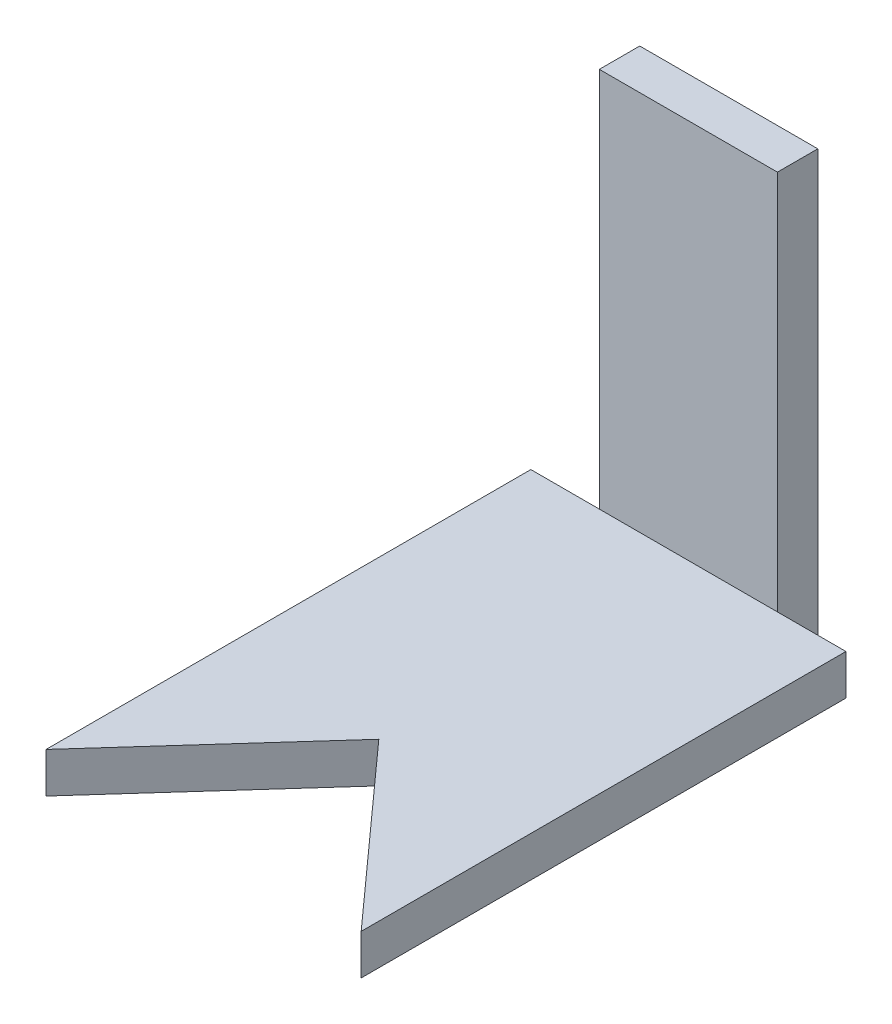
ISO-10303-21;
HEADER;
FILE_DESCRIPTION(('STEP AP214'),'2;1');
FILE_NAME('part.step','',(''),(''),'','','');
FILE_SCHEMA(('AUTOMOTIVE_DESIGN { 1 0 10303 214 1 1 1 1 }'));
ENDSEC;
DATA;
#1=APPLICATION_CONTEXT('core data for automotive mechanical design processes');
#2=APPLICATION_PROTOCOL_DEFINITION('international standard','automotive_design',2000,#1);
#3=PRODUCT_CONTEXT('',#1,'mechanical');
#4=PRODUCT('Part','Part','',(#3));
#5=PRODUCT_RELATED_PRODUCT_CATEGORY('part','',(#4));
#6=PRODUCT_DEFINITION_FORMATION('','',#4);
#7=PRODUCT_DEFINITION_CONTEXT('part definition',#1,'design');
#8=PRODUCT_DEFINITION('design','',#6,#7);
#9=PRODUCT_DEFINITION_SHAPE('','',#8);
#10=(LENGTH_UNIT() NAMED_UNIT(*) SI_UNIT(.MILLI.,.METRE.));
#11=(NAMED_UNIT(*) PLANE_ANGLE_UNIT() SI_UNIT($,.RADIAN.));
#12=(NAMED_UNIT(*) SI_UNIT($,.STERADIAN.) SOLID_ANGLE_UNIT());
#13=UNCERTAINTY_MEASURE_WITH_UNIT(LENGTH_MEASURE(1.E-05),#10,'distance_accuracy_value','');
#14=(GEOMETRIC_REPRESENTATION_CONTEXT(3) GLOBAL_UNCERTAINTY_ASSIGNED_CONTEXT((#13)) GLOBAL_UNIT_ASSIGNED_CONTEXT((#10,
#11,#12)) REPRESENTATION_CONTEXT('',''));
#15=CARTESIAN_POINT('',(0.,0.,0.));
#16=DIRECTION('',(0.,0.,1.));
#17=DIRECTION('',(1.,0.,0.));
#18=AXIS2_PLACEMENT_3D('',#15,#16,#17);
#19=CARTESIAN_POINT('',(0.,0.,6.35));
#20=DIRECTION('',(0.,1.,0.));
#21=DIRECTION('',(0.,0.,1.));
#22=AXIS2_PLACEMENT_3D('',#19,#20,#21);
#23=PLANE('',#22);
#24=DIRECTION('',(0.668646086804001,0.,-0.743580803007781));
#25=VECTOR('',#24,1.);
#26=CARTESIAN_POINT('',(-10.7696,0.,82.55));
#27=LINE('',#26,#25);
#28=CARTESIAN_POINT('',(-10.7696,0.,82.55));
#29=VERTEX_POINT('',#28);
#30=CARTESIAN_POINT('',(13.9954,0.,55.0096031444575));
#31=VERTEX_POINT('',#30);
#32=EDGE_CURVE('E125',#29,#31,#27,.T.);
#33=ORIENTED_EDGE('',*,*,#32,.F.);
#34=DIRECTION('',(0.,0.,-1.));
#35=VECTOR('',#34,1.);
#36=CARTESIAN_POINT('',(-10.7696,0.,82.55));
#37=LINE('',#36,#35);
#38=CARTESIAN_POINT('',(-10.7696,0.,6.35));
#39=VERTEX_POINT('',#38);
#40=EDGE_CURVE('E172',#29,#39,#37,.T.);
#41=ORIENTED_EDGE('',*,*,#40,.T.);
#42=DIRECTION('',(1.,0.,0.));
#43=VECTOR('',#42,1.);
#44=CARTESIAN_POINT('',(-10.7696,0.,6.35));
#45=LINE('',#44,#43);
#46=CARTESIAN_POINT('',(0.,0.,6.35));
#47=VERTEX_POINT('',#46);
#48=EDGE_CURVE('E160',#39,#47,#45,.T.);
#49=ORIENTED_EDGE('',*,*,#48,.T.);
#50=DIRECTION('',(0.,0.,-1.));
#51=VECTOR('',#50,1.);
#52=CARTESIAN_POINT('',(0.,0.,6.35));
#53=LINE('',#52,#51);
#54=CARTESIAN_POINT('',(0.,0.,0.));
#55=VERTEX_POINT('',#54);
#56=EDGE_CURVE('E42',#47,#55,#53,.T.);
#57=ORIENTED_EDGE('',*,*,#56,.T.);
#58=DIRECTION('',(1.,0.,0.));
#59=VECTOR('',#58,1.);
#60=CARTESIAN_POINT('',(0.,0.,0.));
#61=LINE('',#60,#59);
#62=CARTESIAN_POINT('',(27.9908,0.,0.));
#63=VERTEX_POINT('',#62);
#64=EDGE_CURVE('E185',#55,#63,#61,.T.);
#65=ORIENTED_EDGE('',*,*,#64,.T.);
#66=DIRECTION('',(0.,0.,-1.));
#67=VECTOR('',#66,1.);
#68=CARTESIAN_POINT('',(27.9908,0.,6.35));
#69=LINE('',#68,#67);
#70=CARTESIAN_POINT('',(27.9908,0.,6.35));
#71=VERTEX_POINT('',#70);
#72=EDGE_CURVE('E192',#71,#63,#69,.T.);
#73=ORIENTED_EDGE('',*,*,#72,.F.);
#74=CARTESIAN_POINT('',(38.7604,0.,6.35));
#75=VERTEX_POINT('',#74);
#76=EDGE_CURVE('E159',#71,#75,#45,.T.);
#77=ORIENTED_EDGE('',*,*,#76,.T.);
#78=DIRECTION('',(0.,0.,-1.));
#79=VECTOR('',#78,1.);
#80=CARTESIAN_POINT('',(38.7604,0.,82.55));
#81=LINE('',#80,#79);
#82=CARTESIAN_POINT('',(38.7604,0.,82.55));
#83=VERTEX_POINT('',#82);
#84=EDGE_CURVE('E146',#83,#75,#81,.T.);
#85=ORIENTED_EDGE('',*,*,#84,.F.);
#86=DIRECTION('',(0.668646086804001,0.,0.743580803007781));
#87=VECTOR('',#86,1.);
#88=CARTESIAN_POINT('',(13.9954,0.,55.0096031444575));
#89=LINE('',#88,#87);
#90=EDGE_CURVE('E136',#31,#83,#89,.T.);
#91=ORIENTED_EDGE('',*,*,#90,.F.);
#92=EDGE_LOOP('',(#33,#41,#49,#57,#65,#73,#77,#85,#91));
#93=FACE_BOUND('',#92,.T.);
#94=ADVANCED_FACE('F38',(#93),#23,.F.);
#95=CARTESIAN_POINT('',(-10.7696,6.35,82.55));
#96=DIRECTION('',(0.,-1.,0.));
#97=DIRECTION('',(1.,0.,0.));
#98=AXIS2_PLACEMENT_3D('',#95,#96,#97);
#99=PLANE('',#98);
#100=DIRECTION('',(0.668646086804001,0.,-0.743580803007781));
#101=VECTOR('',#100,1.);
#102=CARTESIAN_POINT('',(-10.7696,6.35,82.55));
#103=LINE('',#102,#101);
#104=CARTESIAN_POINT('',(-10.7696,6.35,82.55));
#105=VERTEX_POINT('',#104);
#106=CARTESIAN_POINT('',(13.9954,6.35,55.0096031444575));
#107=VERTEX_POINT('',#106);
#108=EDGE_CURVE('E150',#105,#107,#103,.T.);
#109=ORIENTED_EDGE('',*,*,#108,.T.);
#110=DIRECTION('',(0.668646086804001,0.,0.743580803007781));
#111=VECTOR('',#110,1.);
#112=CARTESIAN_POINT('',(13.9954,6.35,55.0096031444575));
#113=LINE('',#112,#111);
#114=CARTESIAN_POINT('',(38.7604,6.35,82.55));
#115=VERTEX_POINT('',#114);
#116=EDGE_CURVE('E137',#107,#115,#113,.T.);
#117=ORIENTED_EDGE('',*,*,#116,.T.);
#118=DIRECTION('',(0.,0.,-1.));
#119=VECTOR('',#118,1.);
#120=CARTESIAN_POINT('',(38.7604,6.35,82.55));
#121=LINE('',#120,#119);
#122=CARTESIAN_POINT('',(38.7604,6.35,6.35));
#123=VERTEX_POINT('',#122);
#124=EDGE_CURVE('E168',#115,#123,#121,.T.);
#125=ORIENTED_EDGE('',*,*,#124,.T.);
#126=DIRECTION('',(-1.,0.,0.));
#127=VECTOR('',#126,1.);
#128=CARTESIAN_POINT('',(-10.7696,6.35,6.35));
#129=LINE('',#128,#127);
#130=CARTESIAN_POINT('',(27.9908,6.35,6.35));
#131=VERTEX_POINT('',#130);
#132=EDGE_CURVE('E48',#123,#131,#129,.T.);
#133=ORIENTED_EDGE('',*,*,#132,.T.);
#134=CARTESIAN_POINT('',(0.,6.35,6.35));
#135=VERTEX_POINT('',#134);
#136=EDGE_CURVE('E11',#131,#135,#129,.T.);
#137=ORIENTED_EDGE('',*,*,#136,.T.);
#138=CARTESIAN_POINT('',(-10.7696,6.35,6.35));
#139=VERTEX_POINT('',#138);
#140=EDGE_CURVE('E49',#135,#139,#129,.T.);
#141=ORIENTED_EDGE('',*,*,#140,.T.);
#142=DIRECTION('',(0.,0.,-1.));
#143=VECTOR('',#142,1.);
#144=CARTESIAN_POINT('',(-10.7696,6.35,82.55));
#145=LINE('',#144,#143);
#146=EDGE_CURVE('E156',#105,#139,#145,.T.);
#147=ORIENTED_EDGE('',*,*,#146,.F.);
#148=EDGE_LOOP('',(#109,#117,#125,#133,#137,#141,#147));
#149=FACE_BOUND('',#148,.T.);
#150=ADVANCED_FACE('F207',(#149),#99,.F.);
#151=CARTESIAN_POINT('',(0.,0.,6.35));
#152=DIRECTION('',(0.,0.,-1.));
#153=DIRECTION('',(-1.,0.,0.));
#154=AXIS2_PLACEMENT_3D('',#151,#152,#153);
#155=PLANE('',#154);
#156=ORIENTED_EDGE('',*,*,#136,.F.);
#157=DIRECTION('',(0.,1.,0.));
#158=VECTOR('',#157,1.);
#159=CARTESIAN_POINT('',(27.9908,0.,6.35));
#160=LINE('',#159,#158);
#161=CARTESIAN_POINT('',(27.9908,66.2178,6.35));
#162=VERTEX_POINT('',#161);
#163=EDGE_CURVE('E177',#131,#162,#160,.T.);
#164=ORIENTED_EDGE('',*,*,#163,.T.);
#165=DIRECTION('',(-1.,0.,0.));
#166=VECTOR('',#165,1.);
#167=CARTESIAN_POINT('',(0.,66.2178,6.35));
#168=LINE('',#167,#166);
#169=CARTESIAN_POINT('',(0.,66.2178,6.35));
#170=VERTEX_POINT('',#169);
#171=EDGE_CURVE('E60',#162,#170,#168,.T.);
#172=ORIENTED_EDGE('',*,*,#171,.T.);
#173=DIRECTION('',(0.,-1.,0.));
#174=VECTOR('',#173,1.);
#175=CARTESIAN_POINT('',(0.,0.,6.35));
#176=LINE('',#175,#174);
#177=EDGE_CURVE('E175',#170,#135,#176,.T.);
#178=ORIENTED_EDGE('',*,*,#177,.T.);
#179=EDGE_LOOP('',(#156,#164,#172,#178));
#180=FACE_BOUND('',#179,.T.);
#181=ADVANCED_FACE('F205',(#180),#155,.F.);
#182=CARTESIAN_POINT('',(0.,0.,6.35));
#183=DIRECTION('',(1.,0.,0.));
#184=DIRECTION('',(0.,0.,-1.));
#185=AXIS2_PLACEMENT_3D('',#182,#183,#184);
#186=PLANE('',#185);
#187=DIRECTION('',(0.,-1.,0.));
#188=VECTOR('',#187,1.);
#189=CARTESIAN_POINT('',(0.,0.,0.));
#190=LINE('',#189,#188);
#191=CARTESIAN_POINT('',(0.,66.2178,0.));
#192=VERTEX_POINT('',#191);
#193=EDGE_CURVE('E174',#192,#55,#190,.T.);
#194=ORIENTED_EDGE('',*,*,#193,.T.);
#195=ORIENTED_EDGE('',*,*,#56,.F.);
#196=EDGE_CURVE('E178',#135,#47,#176,.T.);
#197=ORIENTED_EDGE('',*,*,#196,.F.);
#198=ORIENTED_EDGE('',*,*,#177,.F.);
#199=DIRECTION('',(0.,0.,-1.));
#200=VECTOR('',#199,1.);
#201=CARTESIAN_POINT('',(0.,66.2178,6.35));
#202=LINE('',#201,#200);
#203=EDGE_CURVE('E183',#170,#192,#202,.T.);
#204=ORIENTED_EDGE('',*,*,#203,.T.);
#205=EDGE_LOOP('',(#194,#195,#197,#198,#204));
#206=FACE_BOUND('',#205,.T.);
#207=ADVANCED_FACE('F40',(#206),#186,.F.);
#208=CARTESIAN_POINT('',(27.9908,0.,6.35));
#209=DIRECTION('',(-1.,0.,0.));
#210=DIRECTION('',(0.,0.,1.));
#211=AXIS2_PLACEMENT_3D('',#208,#209,#210);
#212=PLANE('',#211);
#213=DIRECTION('',(0.,1.,0.));
#214=VECTOR('',#213,1.);
#215=CARTESIAN_POINT('',(27.9908,0.,0.));
#216=LINE('',#215,#214);
#217=CARTESIAN_POINT('',(27.9908,66.2178,0.));
#218=VERTEX_POINT('',#217);
#219=EDGE_CURVE('E187',#63,#218,#216,.T.);
#220=ORIENTED_EDGE('',*,*,#219,.T.);
#221=DIRECTION('',(0.,0.,-1.));
#222=VECTOR('',#221,1.);
#223=CARTESIAN_POINT('',(27.9908,66.2178,6.35));
#224=LINE('',#223,#222);
#225=EDGE_CURVE('E191',#162,#218,#224,.T.);
#226=ORIENTED_EDGE('',*,*,#225,.F.);
#227=ORIENTED_EDGE('',*,*,#163,.F.);
#228=EDGE_CURVE('E179',#71,#131,#160,.T.);
#229=ORIENTED_EDGE('',*,*,#228,.F.);
#230=ORIENTED_EDGE('',*,*,#72,.T.);
#231=EDGE_LOOP('',(#220,#226,#227,#229,#230));
#232=FACE_BOUND('',#231,.T.);
#233=ADVANCED_FACE('F202',(#232),#212,.F.);
#234=CARTESIAN_POINT('',(0.,66.2178,6.35));
#235=DIRECTION('',(0.,-1.,0.));
#236=DIRECTION('',(0.,0.,-1.));
#237=AXIS2_PLACEMENT_3D('',#234,#235,#236);
#238=PLANE('',#237);
#239=DIRECTION('',(-1.,0.,0.));
#240=VECTOR('',#239,1.);
#241=CARTESIAN_POINT('',(0.,66.2178,0.));
#242=LINE('',#241,#240);
#243=EDGE_CURVE('E81',#218,#192,#242,.T.);
#244=ORIENTED_EDGE('',*,*,#243,.T.);
#245=ORIENTED_EDGE('',*,*,#203,.F.);
#246=ORIENTED_EDGE('',*,*,#171,.F.);
#247=ORIENTED_EDGE('',*,*,#225,.T.);
#248=EDGE_LOOP('',(#244,#245,#246,#247));
#249=FACE_BOUND('',#248,.T.);
#250=ADVANCED_FACE('F203',(#249),#238,.F.);
#251=CARTESIAN_POINT('',(0.,0.,0.));
#252=DIRECTION('',(0.,0.,-1.));
#253=DIRECTION('',(-1.,0.,0.));
#254=AXIS2_PLACEMENT_3D('',#251,#252,#253);
#255=PLANE('',#254);
#256=ORIENTED_EDGE('',*,*,#193,.F.);
#257=ORIENTED_EDGE('',*,*,#243,.F.);
#258=ORIENTED_EDGE('',*,*,#219,.F.);
#259=ORIENTED_EDGE('',*,*,#64,.F.);
#260=EDGE_LOOP('',(#256,#257,#258,#259));
#261=FACE_BOUND('',#260,.T.);
#262=ADVANCED_FACE('F200',(#261),#255,.T.);
#263=CARTESIAN_POINT('',(0.,0.,6.35));
#264=DIRECTION('',(0.,0.,-1.));
#265=DIRECTION('',(-1.,0.,0.));
#266=AXIS2_PLACEMENT_3D('',#263,#264,#265);
#267=PLANE('',#266);
#268=ORIENTED_EDGE('',*,*,#140,.F.);
#269=ORIENTED_EDGE('',*,*,#196,.T.);
#270=ORIENTED_EDGE('',*,*,#48,.F.);
#271=DIRECTION('',(0.,-1.,0.));
#272=VECTOR('',#271,1.);
#273=CARTESIAN_POINT('',(-10.7696,0.,6.35));
#274=LINE('',#273,#272);
#275=EDGE_CURVE('E143',#139,#39,#274,.T.);
#276=ORIENTED_EDGE('',*,*,#275,.F.);
#277=EDGE_LOOP('',(#268,#269,#270,#276));
#278=FACE_BOUND('',#277,.T.);
#279=ADVANCED_FACE('F225',(#278),#267,.T.);
#280=CARTESIAN_POINT('',(-10.7696,0.,82.55));
#281=DIRECTION('',(1.,0.,0.));
#282=DIRECTION('',(0.,1.,0.));
#283=AXIS2_PLACEMENT_3D('',#280,#281,#282);
#284=PLANE('',#283);
#285=ORIENTED_EDGE('',*,*,#275,.T.);
#286=ORIENTED_EDGE('',*,*,#40,.F.);
#287=DIRECTION('',(0.,-1.,0.));
#288=VECTOR('',#287,1.);
#289=CARTESIAN_POINT('',(-10.7696,0.,82.55));
#290=LINE('',#289,#288);
#291=EDGE_CURVE('E131',#105,#29,#290,.T.);
#292=ORIENTED_EDGE('',*,*,#291,.F.);
#293=ORIENTED_EDGE('',*,*,#146,.T.);
#294=EDGE_LOOP('',(#285,#286,#292,#293));
#295=FACE_BOUND('',#294,.T.);
#296=ADVANCED_FACE('F229',(#295),#284,.F.);
#297=CARTESIAN_POINT('',(38.7604,0.,82.55));
#298=DIRECTION('',(-1.,0.,0.));
#299=DIRECTION('',(0.,0.,1.));
#300=AXIS2_PLACEMENT_3D('',#297,#298,#299);
#301=PLANE('',#300);
#302=DIRECTION('',(0.,1.,0.));
#303=VECTOR('',#302,1.);
#304=CARTESIAN_POINT('',(38.7604,0.,6.35));
#305=LINE('',#304,#303);
#306=EDGE_CURVE('E163',#75,#123,#305,.T.);
#307=ORIENTED_EDGE('',*,*,#306,.T.);
#308=ORIENTED_EDGE('',*,*,#124,.F.);
#309=DIRECTION('',(0.,1.,0.));
#310=VECTOR('',#309,1.);
#311=CARTESIAN_POINT('',(38.7604,0.,82.55));
#312=LINE('',#311,#310);
#313=EDGE_CURVE('E154',#83,#115,#312,.T.);
#314=ORIENTED_EDGE('',*,*,#313,.F.);
#315=ORIENTED_EDGE('',*,*,#84,.T.);
#316=EDGE_LOOP('',(#307,#308,#314,#315));
#317=FACE_BOUND('',#316,.T.);
#318=ADVANCED_FACE('F236',(#317),#301,.F.);
#319=ORIENTED_EDGE('',*,*,#76,.F.);
#320=ORIENTED_EDGE('',*,*,#228,.T.);
#321=ORIENTED_EDGE('',*,*,#132,.F.);
#322=ORIENTED_EDGE('',*,*,#306,.F.);
#323=EDGE_LOOP('',(#319,#320,#321,#322));
#324=FACE_BOUND('',#323,.T.);
#325=ADVANCED_FACE('F232',(#324),#267,.T.);
#326=CARTESIAN_POINT('',(-10.7696,0.,82.55));
#327=DIRECTION('',(0.743580803007781,0.,0.668646086804001));
#328=DIRECTION('',(0.668646086804001,0.,-0.743580803007781));
#329=AXIS2_PLACEMENT_3D('',#326,#327,#328);
#330=PLANE('',#329);
#331=ORIENTED_EDGE('',*,*,#108,.F.);
#332=ORIENTED_EDGE('',*,*,#291,.T.);
#333=ORIENTED_EDGE('',*,*,#32,.T.);
#334=DIRECTION('',(0.,1.,0.));
#335=VECTOR('',#334,1.);
#336=CARTESIAN_POINT('',(13.9954,0.,55.0096031444575));
#337=LINE('',#336,#335);
#338=EDGE_CURVE('E128',#31,#107,#337,.T.);
#339=ORIENTED_EDGE('',*,*,#338,.T.);
#340=EDGE_LOOP('',(#331,#332,#333,#339));
#341=FACE_BOUND('',#340,.T.);
#342=ADVANCED_FACE('F127',(#341),#330,.T.);
#343=CARTESIAN_POINT('',(13.9954,0.,55.0096031444575));
#344=DIRECTION('',(-0.743580803007781,0.,0.668646086804001));
#345=DIRECTION('',(0.668646086804001,0.,0.743580803007781));
#346=AXIS2_PLACEMENT_3D('',#343,#344,#345);
#347=PLANE('',#346);
#348=ORIENTED_EDGE('',*,*,#116,.F.);
#349=ORIENTED_EDGE('',*,*,#338,.F.);
#350=ORIENTED_EDGE('',*,*,#90,.T.);
#351=ORIENTED_EDGE('',*,*,#313,.T.);
#352=EDGE_LOOP('',(#348,#349,#350,#351));
#353=FACE_BOUND('',#352,.T.);
#354=ADVANCED_FACE('F140',(#353),#347,.T.);
#355=CLOSED_SHELL('',(#94,#150,#181,#207,#233,#250,#262,#279,#296,#318,#325,#342,#354));
#356=MANIFOLD_SOLID_BREP('B2',#355);
#357=ADVANCED_BREP_SHAPE_REPRESENTATION('',(#18,#356),#14);
#358=SHAPE_DEFINITION_REPRESENTATION(#9,#357);
ENDSEC;
END-ISO-10303-21;
